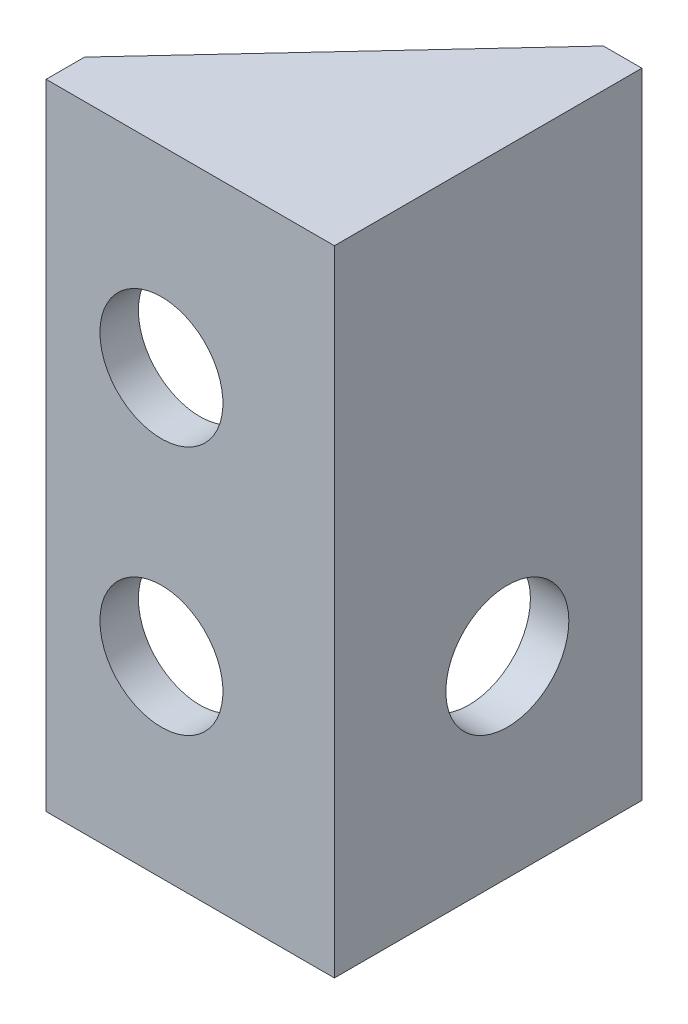
ISO-10303-21;
HEADER;
FILE_DESCRIPTION(('STEP AP214'),'2;1');
FILE_NAME('part.step','',(''),(''),'','','');
FILE_SCHEMA(('AUTOMOTIVE_DESIGN { 1 0 10303 214 1 1 1 1 }'));
ENDSEC;
DATA;
#1=APPLICATION_CONTEXT('core data for automotive mechanical design processes');
#2=APPLICATION_PROTOCOL_DEFINITION('international standard','automotive_design',2000,#1);
#3=PRODUCT_CONTEXT('',#1,'mechanical');
#4=PRODUCT('Part','Part','',(#3));
#5=PRODUCT_RELATED_PRODUCT_CATEGORY('part','',(#4));
#6=PRODUCT_DEFINITION_FORMATION('','',#4);
#7=PRODUCT_DEFINITION_CONTEXT('part definition',#1,'design');
#8=PRODUCT_DEFINITION('design','',#6,#7);
#9=PRODUCT_DEFINITION_SHAPE('','',#8);
#10=(LENGTH_UNIT() NAMED_UNIT(*) SI_UNIT(.MILLI.,.METRE.));
#11=(NAMED_UNIT(*) PLANE_ANGLE_UNIT() SI_UNIT($,.RADIAN.));
#12=(NAMED_UNIT(*) SI_UNIT($,.STERADIAN.) SOLID_ANGLE_UNIT());
#13=UNCERTAINTY_MEASURE_WITH_UNIT(LENGTH_MEASURE(1.E-05),#10,'distance_accuracy_value','');
#14=(GEOMETRIC_REPRESENTATION_CONTEXT(3) GLOBAL_UNCERTAINTY_ASSIGNED_CONTEXT((#13)) GLOBAL_UNIT_ASSIGNED_CONTEXT((#10,
#11,#12)) REPRESENTATION_CONTEXT('',''));
#15=CARTESIAN_POINT('',(0.,0.,0.));
#16=DIRECTION('',(0.,0.,1.));
#17=DIRECTION('',(1.,0.,0.));
#18=AXIS2_PLACEMENT_3D('',#15,#16,#17);
#19=CARTESIAN_POINT('',(6.5,16.5,-8.));
#20=DIRECTION('',(1.,0.,0.));
#21=DIRECTION('',(0.,0.,-1.));
#22=AXIS2_PLACEMENT_3D('',#19,#20,#21);
#23=PLANE('',#22);
#24=CARTESIAN_POINT('',(6.5,5.,-4.5));
#25=DIRECTION('',(1.,0.,0.));
#26=DIRECTION('',(0.,0.,-1.));
#27=AXIS2_PLACEMENT_3D('',#24,#25,#26);
#28=CIRCLE('',#27,1.6);
#29=CARTESIAN_POINT('',(6.5,5.,-6.1));
#30=VERTEX_POINT('',#29);
#31=EDGE_CURVE('E41',#30,#30,#28,.T.);
#32=ORIENTED_EDGE('',*,*,#31,.T.);
#33=EDGE_LOOP('',(#32));
#34=FACE_BOUND('',#33,.T.);
#35=DIRECTION('',(0.,0.,-1.));
#36=VECTOR('',#35,1.);
#37=CARTESIAN_POINT('',(6.5,15.5,-1.));
#38=LINE('',#37,#36);
#39=CARTESIAN_POINT('',(6.5,15.5,-1.));
#40=VERTEX_POINT('',#39);
#41=CARTESIAN_POINT('',(6.5,15.5,-8.));
#42=VERTEX_POINT('',#41);
#43=EDGE_CURVE('E109',#40,#42,#38,.T.);
#44=ORIENTED_EDGE('',*,*,#43,.T.);
#45=DIRECTION('',(0.,-1.,0.));
#46=VECTOR('',#45,1.);
#47=CARTESIAN_POINT('',(6.5,16.5,-8.));
#48=LINE('',#47,#46);
#49=CARTESIAN_POINT('',(6.5,1.,-8.));
#50=VERTEX_POINT('',#49);
#51=EDGE_CURVE('E53',#42,#50,#48,.T.);
#52=ORIENTED_EDGE('',*,*,#51,.T.);
#53=DIRECTION('',(0.,0.,1.));
#54=VECTOR('',#53,1.);
#55=CARTESIAN_POINT('',(6.5,1.,-1.));
#56=LINE('',#55,#54);
#57=CARTESIAN_POINT('',(6.5,1.,-1.));
#58=VERTEX_POINT('',#57);
#59=EDGE_CURVE('E193',#50,#58,#56,.T.);
#60=ORIENTED_EDGE('',*,*,#59,.T.);
#61=DIRECTION('',(0.,-1.,0.));
#62=VECTOR('',#61,1.);
#63=CARTESIAN_POINT('',(6.5,16.5,-1.));
#64=LINE('',#63,#62);
#65=EDGE_CURVE('E61',#40,#58,#64,.T.);
#66=ORIENTED_EDGE('',*,*,#65,.F.);
#67=EDGE_LOOP('',(#44,#52,#60,#66));
#68=FACE_BOUND('',#67,.T.);
#69=ADVANCED_FACE('F37',(#34,#68),#23,.F.);
#70=CARTESIAN_POINT('',(6.5,16.5,-1.));
#71=DIRECTION('',(0.,0.,1.));
#72=DIRECTION('',(1.,0.,0.));
#73=AXIS2_PLACEMENT_3D('',#70,#71,#72);
#74=PLANE('',#73);
#75=CARTESIAN_POINT('',(3.,11.5,-1.));
#76=DIRECTION('',(0.,0.,-1.));
#77=DIRECTION('',(-1.,0.,0.));
#78=AXIS2_PLACEMENT_3D('',#75,#76,#77);
#79=CIRCLE('',#78,1.6);
#80=CARTESIAN_POINT('',(1.4,11.5,-1.));
#81=VERTEX_POINT('',#80);
#82=EDGE_CURVE('E179',#81,#81,#79,.T.);
#83=ORIENTED_EDGE('',*,*,#82,.F.);
#84=EDGE_LOOP('',(#83));
#85=FACE_BOUND('',#84,.T.);
#86=CARTESIAN_POINT('',(3.,5.,-1.));
#87=DIRECTION('',(0.,0.,-1.));
#88=DIRECTION('',(-1.,0.,0.));
#89=AXIS2_PLACEMENT_3D('',#86,#87,#88);
#90=CIRCLE('',#89,1.6);
#91=CARTESIAN_POINT('',(1.4,5.,-1.));
#92=VERTEX_POINT('',#91);
#93=EDGE_CURVE('E178',#92,#92,#90,.T.);
#94=ORIENTED_EDGE('',*,*,#93,.F.);
#95=EDGE_LOOP('',(#94));
#96=FACE_BOUND('',#95,.T.);
#97=DIRECTION('',(1.,0.,0.));
#98=VECTOR('',#97,1.);
#99=CARTESIAN_POINT('',(0.,15.5,-1.));
#100=LINE('',#99,#98);
#101=CARTESIAN_POINT('',(0.,15.5,-1.));
#102=VERTEX_POINT('',#101);
#103=EDGE_CURVE('E105',#102,#40,#100,.T.);
#104=ORIENTED_EDGE('',*,*,#103,.T.);
#105=ORIENTED_EDGE('',*,*,#65,.T.);
#106=DIRECTION('',(-1.,0.,0.));
#107=VECTOR('',#106,1.);
#108=CARTESIAN_POINT('',(0.,1.,-1.));
#109=LINE('',#108,#107);
#110=CARTESIAN_POINT('',(0.,1.,-1.));
#111=VERTEX_POINT('',#110);
#112=EDGE_CURVE('E125',#58,#111,#109,.T.);
#113=ORIENTED_EDGE('',*,*,#112,.T.);
#114=DIRECTION('',(0.,-1.,0.));
#115=VECTOR('',#114,1.);
#116=CARTESIAN_POINT('',(0.,16.5,-1.));
#117=LINE('',#116,#115);
#118=EDGE_CURVE('E122',#102,#111,#117,.T.);
#119=ORIENTED_EDGE('',*,*,#118,.F.);
#120=EDGE_LOOP('',(#104,#105,#113,#119));
#121=FACE_BOUND('',#120,.T.);
#122=ADVANCED_FACE('F123',(#85,#96,#121),#74,.F.);
#123=CARTESIAN_POINT('',(0.,16.5,-1.));
#124=DIRECTION('',(1.,0.,0.));
#125=DIRECTION('',(0.,0.,-1.));
#126=AXIS2_PLACEMENT_3D('',#123,#124,#125);
#127=PLANE('',#126);
#128=DIRECTION('',(0.,0.,1.));
#129=VECTOR('',#128,1.);
#130=CARTESIAN_POINT('',(0.,0.,-1.));
#131=LINE('',#130,#129);
#132=CARTESIAN_POINT('',(0.,0.,-1.));
#133=VERTEX_POINT('',#132);
#134=CARTESIAN_POINT('',(0.,0.,0.));
#135=VERTEX_POINT('',#134);
#136=EDGE_CURVE('E159',#133,#135,#131,.T.);
#137=ORIENTED_EDGE('',*,*,#136,.T.);
#138=DIRECTION('',(0.,-1.,0.));
#139=VECTOR('',#138,1.);
#140=CARTESIAN_POINT('',(0.,16.5,0.));
#141=LINE('',#140,#139);
#142=CARTESIAN_POINT('',(0.,16.5,0.));
#143=VERTEX_POINT('',#142);
#144=EDGE_CURVE('E11',#143,#135,#141,.T.);
#145=ORIENTED_EDGE('',*,*,#144,.F.);
#146=DIRECTION('',(0.,0.,1.));
#147=VECTOR('',#146,1.);
#148=CARTESIAN_POINT('',(0.,16.5,-1.));
#149=LINE('',#148,#147);
#150=CARTESIAN_POINT('',(0.,16.5,-1.));
#151=VERTEX_POINT('',#150);
#152=EDGE_CURVE('E133',#151,#143,#149,.T.);
#153=ORIENTED_EDGE('',*,*,#152,.F.);
#154=EDGE_CURVE('E116',#151,#102,#117,.T.);
#155=ORIENTED_EDGE('',*,*,#154,.T.);
#156=ORIENTED_EDGE('',*,*,#118,.T.);
#157=DIRECTION('',(0.,-1.,0.));
#158=VECTOR('',#157,1.);
#159=CARTESIAN_POINT('',(0.,1.,-1.));
#160=LINE('',#159,#158);
#161=EDGE_CURVE('E182',#111,#133,#160,.T.);
#162=ORIENTED_EDGE('',*,*,#161,.T.);
#163=EDGE_LOOP('',(#137,#145,#153,#155,#156,#162));
#164=FACE_BOUND('',#163,.T.);
#165=ADVANCED_FACE('F39',(#164),#127,.F.);
#166=CARTESIAN_POINT('',(0.,16.5,0.));
#167=DIRECTION('',(0.,0.,-1.));
#168=DIRECTION('',(-1.,0.,0.));
#169=AXIS2_PLACEMENT_3D('',#166,#167,#168);
#170=PLANE('',#169);
#171=CARTESIAN_POINT('',(3.,5.,0.));
#172=DIRECTION('',(0.,0.,-1.));
#173=DIRECTION('',(-1.,0.,0.));
#174=AXIS2_PLACEMENT_3D('',#171,#172,#173);
#175=CIRCLE('',#174,1.6);
#176=CARTESIAN_POINT('',(1.4,5.,0.));
#177=VERTEX_POINT('',#176);
#178=EDGE_CURVE('E172',#177,#177,#175,.T.);
#179=ORIENTED_EDGE('',*,*,#178,.T.);
#180=EDGE_LOOP('',(#179));
#181=FACE_BOUND('',#180,.T.);
#182=CARTESIAN_POINT('',(3.,11.5,0.));
#183=DIRECTION('',(0.,0.,-1.));
#184=DIRECTION('',(-1.,0.,0.));
#185=AXIS2_PLACEMENT_3D('',#182,#183,#184);
#186=CIRCLE('',#185,1.6);
#187=CARTESIAN_POINT('',(1.4,11.5,0.));
#188=VERTEX_POINT('',#187);
#189=EDGE_CURVE('E175',#188,#188,#186,.T.);
#190=ORIENTED_EDGE('',*,*,#189,.T.);
#191=EDGE_LOOP('',(#190));
#192=FACE_BOUND('',#191,.T.);
#193=DIRECTION('',(1.,0.,0.));
#194=VECTOR('',#193,1.);
#195=CARTESIAN_POINT('',(0.,0.,0.));
#196=LINE('',#195,#194);
#197=CARTESIAN_POINT('',(7.5,0.,0.));
#198=VERTEX_POINT('',#197);
#199=EDGE_CURVE('E157',#135,#198,#196,.T.);
#200=ORIENTED_EDGE('',*,*,#199,.T.);
#201=DIRECTION('',(0.,-1.,0.));
#202=VECTOR('',#201,1.);
#203=CARTESIAN_POINT('',(7.5,16.5,0.));
#204=LINE('',#203,#202);
#205=CARTESIAN_POINT('',(7.5,16.5,0.));
#206=VERTEX_POINT('',#205);
#207=EDGE_CURVE('E46',#206,#198,#204,.T.);
#208=ORIENTED_EDGE('',*,*,#207,.F.);
#209=DIRECTION('',(1.,0.,0.));
#210=VECTOR('',#209,1.);
#211=CARTESIAN_POINT('',(0.,16.5,0.));
#212=LINE('',#211,#210);
#213=EDGE_CURVE('E166',#143,#206,#212,.T.);
#214=ORIENTED_EDGE('',*,*,#213,.F.);
#215=ORIENTED_EDGE('',*,*,#144,.T.);
#216=EDGE_LOOP('',(#200,#208,#214,#215));
#217=FACE_BOUND('',#216,.T.);
#218=ADVANCED_FACE('F208',(#181,#192,#217),#170,.F.);
#219=CARTESIAN_POINT('',(7.5,16.5,0.));
#220=DIRECTION('',(-1.,0.,0.));
#221=DIRECTION('',(0.,0.,1.));
#222=AXIS2_PLACEMENT_3D('',#219,#220,#221);
#223=PLANE('',#222);
#224=CARTESIAN_POINT('',(7.5,5.,-4.5));
#225=DIRECTION('',(1.,0.,0.));
#226=DIRECTION('',(0.,0.,-1.));
#227=AXIS2_PLACEMENT_3D('',#224,#225,#226);
#228=CIRCLE('',#227,1.6);
#229=CARTESIAN_POINT('',(7.5,5.,-6.1));
#230=VERTEX_POINT('',#229);
#231=EDGE_CURVE('E169',#230,#230,#228,.T.);
#232=ORIENTED_EDGE('',*,*,#231,.F.);
#233=EDGE_LOOP('',(#232));
#234=FACE_BOUND('',#233,.T.);
#235=DIRECTION('',(0.,0.,-1.));
#236=VECTOR('',#235,1.);
#237=CARTESIAN_POINT('',(7.5,0.,0.));
#238=LINE('',#237,#236);
#239=CARTESIAN_POINT('',(7.5,0.,-8.));
#240=VERTEX_POINT('',#239);
#241=EDGE_CURVE('E150',#198,#240,#238,.T.);
#242=ORIENTED_EDGE('',*,*,#241,.T.);
#243=DIRECTION('',(0.,-1.,0.));
#244=VECTOR('',#243,1.);
#245=CARTESIAN_POINT('',(7.5,16.5,-8.));
#246=LINE('',#245,#244);
#247=CARTESIAN_POINT('',(7.5,16.5,-8.));
#248=VERTEX_POINT('',#247);
#249=EDGE_CURVE('E140',#248,#240,#246,.T.);
#250=ORIENTED_EDGE('',*,*,#249,.F.);
#251=DIRECTION('',(0.,0.,-1.));
#252=VECTOR('',#251,1.);
#253=CARTESIAN_POINT('',(7.5,16.5,0.));
#254=LINE('',#253,#252);
#255=EDGE_CURVE('E151',#206,#248,#254,.T.);
#256=ORIENTED_EDGE('',*,*,#255,.F.);
#257=ORIENTED_EDGE('',*,*,#207,.T.);
#258=EDGE_LOOP('',(#242,#250,#256,#257));
#259=FACE_BOUND('',#258,.T.);
#260=ADVANCED_FACE('F148',(#234,#259),#223,.F.);
#261=CARTESIAN_POINT('',(7.5,16.5,-8.));
#262=DIRECTION('',(0.,0.,1.));
#263=DIRECTION('',(1.,0.,0.));
#264=AXIS2_PLACEMENT_3D('',#261,#262,#263);
#265=PLANE('',#264);
#266=DIRECTION('',(-1.,0.,0.));
#267=VECTOR('',#266,1.);
#268=CARTESIAN_POINT('',(7.5,0.,-8.));
#269=LINE('',#268,#267);
#270=CARTESIAN_POINT('',(6.5,0.,-8.));
#271=VERTEX_POINT('',#270);
#272=EDGE_CURVE('E136',#240,#271,#269,.T.);
#273=ORIENTED_EDGE('',*,*,#272,.T.);
#274=DIRECTION('',(0.,-1.,0.));
#275=VECTOR('',#274,1.);
#276=CARTESIAN_POINT('',(6.5,1.,-8.));
#277=LINE('',#276,#275);
#278=EDGE_CURVE('E185',#50,#271,#277,.T.);
#279=ORIENTED_EDGE('',*,*,#278,.F.);
#280=ORIENTED_EDGE('',*,*,#51,.F.);
#281=CARTESIAN_POINT('',(6.5,16.5,-8.));
#282=VERTEX_POINT('',#281);
#283=EDGE_CURVE('E119',#282,#42,#48,.T.);
#284=ORIENTED_EDGE('',*,*,#283,.F.);
#285=DIRECTION('',(-1.,0.,0.));
#286=VECTOR('',#285,1.);
#287=CARTESIAN_POINT('',(7.5,16.5,-8.));
#288=LINE('',#287,#286);
#289=EDGE_CURVE('E128',#248,#282,#288,.T.);
#290=ORIENTED_EDGE('',*,*,#289,.F.);
#291=ORIENTED_EDGE('',*,*,#249,.T.);
#292=EDGE_LOOP('',(#273,#279,#280,#284,#290,#291));
#293=FACE_BOUND('',#292,.T.);
#294=ADVANCED_FACE('F199',(#293),#265,.F.);
#295=CARTESIAN_POINT('',(0.,16.5,0.));
#296=DIRECTION('',(0.,1.,0.));
#297=DIRECTION('',(0.,0.,1.));
#298=AXIS2_PLACEMENT_3D('',#295,#296,#297);
#299=PLANE('',#298);
#300=ORIENTED_EDGE('',*,*,#152,.T.);
#301=ORIENTED_EDGE('',*,*,#213,.T.);
#302=ORIENTED_EDGE('',*,*,#255,.T.);
#303=ORIENTED_EDGE('',*,*,#289,.T.);
#304=DIRECTION('',(-0.680451099367278,0.,0.732793491626299));
#305=VECTOR('',#304,1.);
#306=CARTESIAN_POINT('',(6.5,16.5,-8.));
#307=LINE('',#306,#305);
#308=EDGE_CURVE('E120',#282,#151,#307,.T.);
#309=ORIENTED_EDGE('',*,*,#308,.T.);
#310=EDGE_LOOP('',(#300,#301,#302,#303,#309));
#311=FACE_BOUND('',#310,.T.);
#312=ADVANCED_FACE('F210',(#311),#299,.T.);
#313=CARTESIAN_POINT('',(0.,0.,0.));
#314=DIRECTION('',(0.,1.,0.));
#315=DIRECTION('',(0.,0.,1.));
#316=AXIS2_PLACEMENT_3D('',#313,#314,#315);
#317=PLANE('',#316);
#318=ORIENTED_EDGE('',*,*,#136,.F.);
#319=DIRECTION('',(0.680451099367278,0.,-0.732793491626299));
#320=VECTOR('',#319,1.);
#321=CARTESIAN_POINT('',(6.5,0.,-8.));
#322=LINE('',#321,#320);
#323=EDGE_CURVE('E189',#133,#271,#322,.T.);
#324=ORIENTED_EDGE('',*,*,#323,.T.);
#325=ORIENTED_EDGE('',*,*,#272,.F.);
#326=ORIENTED_EDGE('',*,*,#241,.F.);
#327=ORIENTED_EDGE('',*,*,#199,.F.);
#328=EDGE_LOOP('',(#318,#324,#325,#326,#327));
#329=FACE_BOUND('',#328,.T.);
#330=ADVANCED_FACE('F156',(#329),#317,.F.);
#331=CARTESIAN_POINT('',(1.5,5.,-4.5));
#332=DIRECTION('',(1.,0.,0.));
#333=DIRECTION('',(0.,0.,-1.));
#334=AXIS2_PLACEMENT_3D('',#331,#332,#333);
#335=CYLINDRICAL_SURFACE('',#334,1.6);
#336=ORIENTED_EDGE('',*,*,#231,.T.);
#337=EDGE_LOOP('',(#336));
#338=FACE_BOUND('',#337,.T.);
#339=ORIENTED_EDGE('',*,*,#31,.F.);
#340=EDGE_LOOP('',(#339));
#341=FACE_BOUND('',#340,.T.);
#342=ADVANCED_FACE('F217',(#338,#341),#335,.F.);
#343=CARTESIAN_POINT('',(3.,11.5,9.));
#344=DIRECTION('',(0.,0.,-1.));
#345=DIRECTION('',(-1.,0.,0.));
#346=AXIS2_PLACEMENT_3D('',#343,#344,#345);
#347=CYLINDRICAL_SURFACE('',#346,1.6);
#348=ORIENTED_EDGE('',*,*,#82,.T.);
#349=EDGE_LOOP('',(#348));
#350=FACE_BOUND('',#349,.T.);
#351=ORIENTED_EDGE('',*,*,#189,.F.);
#352=EDGE_LOOP('',(#351));
#353=FACE_BOUND('',#352,.T.);
#354=ADVANCED_FACE('F242',(#350,#353),#347,.F.);
#355=CARTESIAN_POINT('',(3.,5.,9.));
#356=DIRECTION('',(0.,0.,-1.));
#357=DIRECTION('',(-1.,0.,0.));
#358=AXIS2_PLACEMENT_3D('',#355,#356,#357);
#359=CYLINDRICAL_SURFACE('',#358,1.6);
#360=ORIENTED_EDGE('',*,*,#93,.T.);
#361=EDGE_LOOP('',(#360));
#362=FACE_BOUND('',#361,.T.);
#363=ORIENTED_EDGE('',*,*,#178,.F.);
#364=EDGE_LOOP('',(#363));
#365=FACE_BOUND('',#364,.T.);
#366=ADVANCED_FACE('F244',(#362,#365),#359,.F.);
#367=CARTESIAN_POINT('',(6.5,1.,-8.));
#368=DIRECTION('',(-0.732793491626299,0.,-0.680451099367278));
#369=DIRECTION('',(-0.680451099367278,0.,0.732793491626299));
#370=AXIS2_PLACEMENT_3D('',#367,#368,#369);
#371=PLANE('',#370);
#372=ORIENTED_EDGE('',*,*,#323,.F.);
#373=ORIENTED_EDGE('',*,*,#161,.F.);
#374=DIRECTION('',(0.680451099367278,0.,-0.732793491626299));
#375=VECTOR('',#374,1.);
#376=CARTESIAN_POINT('',(6.5,1.,-8.));
#377=LINE('',#376,#375);
#378=EDGE_CURVE('E191',#111,#50,#377,.T.);
#379=ORIENTED_EDGE('',*,*,#378,.T.);
#380=ORIENTED_EDGE('',*,*,#278,.T.);
#381=EDGE_LOOP('',(#372,#373,#379,#380));
#382=FACE_BOUND('',#381,.T.);
#383=ADVANCED_FACE('F207',(#382),#371,.T.);
#384=CARTESIAN_POINT('',(0.,1.,0.));
#385=DIRECTION('',(0.,1.,0.));
#386=DIRECTION('',(0.,0.,1.));
#387=AXIS2_PLACEMENT_3D('',#384,#385,#386);
#388=PLANE('',#387);
#389=ORIENTED_EDGE('',*,*,#378,.F.);
#390=ORIENTED_EDGE('',*,*,#112,.F.);
#391=ORIENTED_EDGE('',*,*,#59,.F.);
#392=EDGE_LOOP('',(#389,#390,#391));
#393=FACE_BOUND('',#392,.T.);
#394=ADVANCED_FACE('F206',(#393),#388,.T.);
#395=CARTESIAN_POINT('',(6.5,15.5,-8.));
#396=DIRECTION('',(-0.732793491626299,0.,-0.680451099367278));
#397=DIRECTION('',(-0.680451099367278,0.,0.732793491626299));
#398=AXIS2_PLACEMENT_3D('',#395,#396,#397);
#399=PLANE('',#398);
#400=ORIENTED_EDGE('',*,*,#308,.F.);
#401=ORIENTED_EDGE('',*,*,#283,.T.);
#402=DIRECTION('',(-0.680451099367278,0.,0.732793491626299));
#403=VECTOR('',#402,1.);
#404=CARTESIAN_POINT('',(6.5,15.5,-8.));
#405=LINE('',#404,#403);
#406=EDGE_CURVE('E108',#42,#102,#405,.T.);
#407=ORIENTED_EDGE('',*,*,#406,.T.);
#408=ORIENTED_EDGE('',*,*,#154,.F.);
#409=EDGE_LOOP('',(#400,#401,#407,#408));
#410=FACE_BOUND('',#409,.T.);
#411=ADVANCED_FACE('F114',(#410),#399,.T.);
#412=CARTESIAN_POINT('',(0.,15.5,0.));
#413=DIRECTION('',(0.,1.,0.));
#414=DIRECTION('',(0.,0.,1.));
#415=AXIS2_PLACEMENT_3D('',#412,#413,#414);
#416=PLANE('',#415);
#417=ORIENTED_EDGE('',*,*,#406,.F.);
#418=ORIENTED_EDGE('',*,*,#43,.F.);
#419=ORIENTED_EDGE('',*,*,#103,.F.);
#420=EDGE_LOOP('',(#417,#418,#419));
#421=FACE_BOUND('',#420,.T.);
#422=ADVANCED_FACE('F107',(#421),#416,.F.);
#423=CLOSED_SHELL('',(#69,#122,#165,#218,#260,#294,#312,#330,#342,#354,#366,#383,#394,#411,#422));
#424=MANIFOLD_SOLID_BREP('B2',#423);
#425=ADVANCED_BREP_SHAPE_REPRESENTATION('',(#18,#424),#14);
#426=SHAPE_DEFINITION_REPRESENTATION(#9,#425);
ENDSEC;
END-ISO-10303-21;
